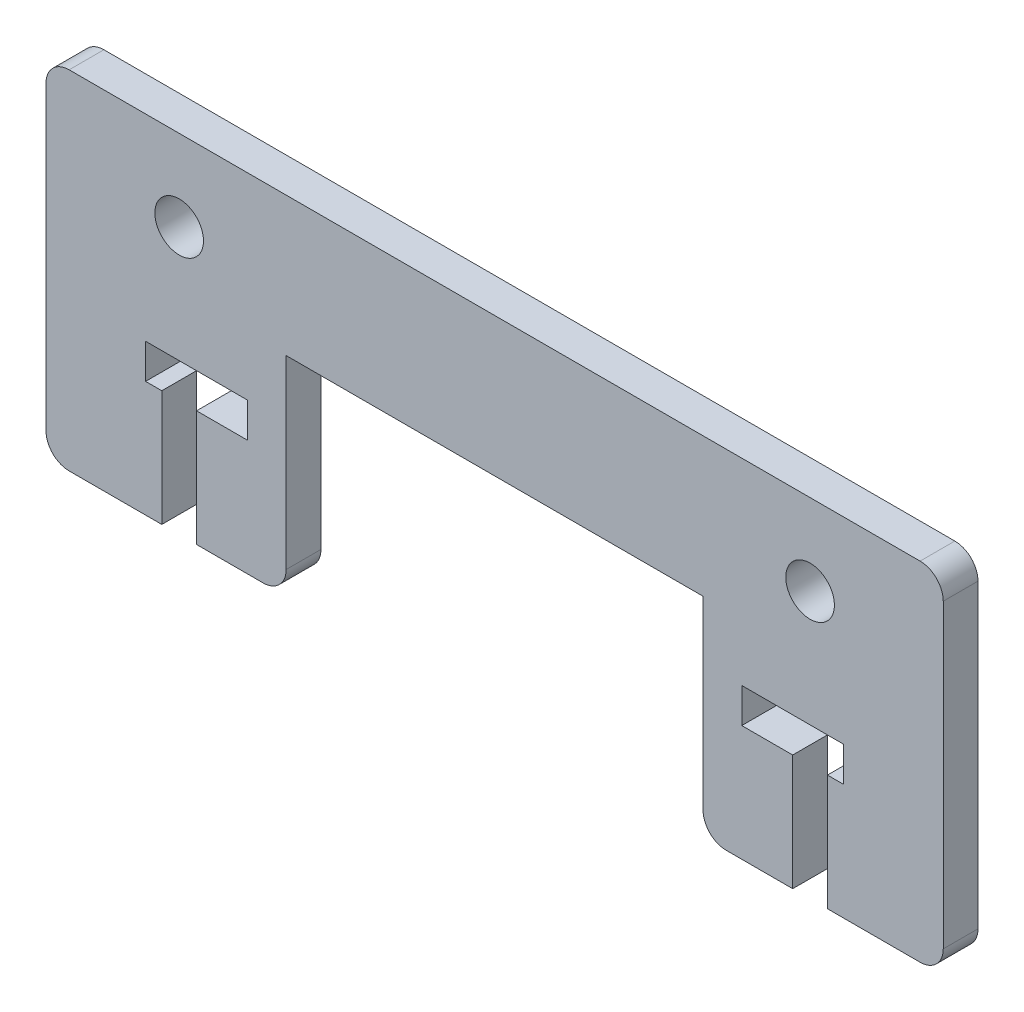
ISO-10303-21;
HEADER;
FILE_DESCRIPTION(('STEP AP214'),'2;1');
FILE_NAME('part.step','',(''),(''),'','','');
FILE_SCHEMA(('AUTOMOTIVE_DESIGN { 1 0 10303 214 1 1 1 1 }'));
ENDSEC;
DATA;
#1=APPLICATION_CONTEXT('core data for automotive mechanical design processes');
#2=APPLICATION_PROTOCOL_DEFINITION('international standard','automotive_design',2000,#1);
#3=PRODUCT_CONTEXT('',#1,'mechanical');
#4=PRODUCT('Part','Part','',(#3));
#5=PRODUCT_RELATED_PRODUCT_CATEGORY('part','',(#4));
#6=PRODUCT_DEFINITION_FORMATION('','',#4);
#7=PRODUCT_DEFINITION_CONTEXT('part definition',#1,'design');
#8=PRODUCT_DEFINITION('design','',#6,#7);
#9=PRODUCT_DEFINITION_SHAPE('','',#8);
#10=(LENGTH_UNIT() NAMED_UNIT(*) SI_UNIT(.MILLI.,.METRE.));
#11=(NAMED_UNIT(*) PLANE_ANGLE_UNIT() SI_UNIT($,.RADIAN.));
#12=(NAMED_UNIT(*) SI_UNIT($,.STERADIAN.) SOLID_ANGLE_UNIT());
#13=UNCERTAINTY_MEASURE_WITH_UNIT(LENGTH_MEASURE(1.E-05),#10,'distance_accuracy_value','');
#14=(GEOMETRIC_REPRESENTATION_CONTEXT(3) GLOBAL_UNCERTAINTY_ASSIGNED_CONTEXT((#13)) GLOBAL_UNIT_ASSIGNED_CONTEXT((#10,
#11,#12)) REPRESENTATION_CONTEXT('',''));
#15=CARTESIAN_POINT('',(0.,0.,0.));
#16=DIRECTION('',(0.,0.,1.));
#17=DIRECTION('',(1.,0.,0.));
#18=AXIS2_PLACEMENT_3D('',#15,#16,#17);
#19=CARTESIAN_POINT('',(0.,0.,1.5));
#20=DIRECTION('',(0.,0.,1.));
#21=DIRECTION('',(1.,0.,0.));
#22=AXIS2_PLACEMENT_3D('',#19,#20,#21);
#23=PLANE('',#22);
#24=CARTESIAN_POINT('',(27.94,53.4586120346529,1.5));
#25=DIRECTION('',(0.,0.,1.));
#26=DIRECTION('',(1.,0.,0.));
#27=AXIS2_PLACEMENT_3D('',#24,#25,#26);
#28=CIRCLE('',#27,1.05);
#29=CARTESIAN_POINT('',(28.99,53.4586120346529,1.5));
#30=VERTEX_POINT('',#29);
#31=EDGE_CURVE('E542',#30,#30,#28,.T.);
#32=ORIENTED_EDGE('',*,*,#31,.F.);
#33=EDGE_LOOP('',(#32));
#34=FACE_BOUND('',#33,.T.);
#35=DIRECTION('',(0.,-1.,0.));
#36=VECTOR('',#35,1.);
#37=CARTESIAN_POINT('',(23.32,41.9586120346529,1.5));
#38=LINE('',#37,#36);
#39=CARTESIAN_POINT('',(23.32,50.9586120346529,1.5));
#40=VERTEX_POINT('',#39);
#41=CARTESIAN_POINT('',(23.32,42.9586120346529,1.5));
#42=VERTEX_POINT('',#41);
#43=EDGE_CURVE('E560',#40,#42,#38,.T.);
#44=ORIENTED_EDGE('',*,*,#43,.T.);
#45=CARTESIAN_POINT('',(24.32,42.9586120346529,1.5));
#46=DIRECTION('',(0.,0.,1.));
#47=DIRECTION('',(1.,0.,0.));
#48=AXIS2_PLACEMENT_3D('',#45,#46,#47);
#49=CIRCLE('',#48,1.);
#50=CARTESIAN_POINT('',(24.32,41.9586120346529,1.5));
#51=VERTEX_POINT('',#50);
#52=EDGE_CURVE('E311',#42,#51,#49,.T.);
#53=ORIENTED_EDGE('',*,*,#52,.T.);
#54=DIRECTION('',(1.,0.,0.));
#55=VECTOR('',#54,1.);
#56=CARTESIAN_POINT('',(23.32,41.9586120346529,1.5));
#57=LINE('',#56,#55);
#58=CARTESIAN_POINT('',(27.19,41.9586120346529,1.5));
#59=VERTEX_POINT('',#58);
#60=EDGE_CURVE('E566',#51,#59,#57,.T.);
#61=ORIENTED_EDGE('',*,*,#60,.T.);
#62=DIRECTION('',(0.,1.,0.));
#63=VECTOR('',#62,1.);
#64=CARTESIAN_POINT('',(27.19,41.9586120346529,1.5));
#65=LINE('',#64,#63);
#66=CARTESIAN_POINT('',(27.19,46.9586120346529,1.5));
#67=VERTEX_POINT('',#66);
#68=EDGE_CURVE('E569',#59,#67,#65,.T.);
#69=ORIENTED_EDGE('',*,*,#68,.T.);
#70=DIRECTION('',(-1.,0.,0.));
#71=VECTOR('',#70,1.);
#72=CARTESIAN_POINT('',(27.19,46.9586120346529,1.5));
#73=LINE('',#72,#71);
#74=CARTESIAN_POINT('',(24.99,46.9586120346529,1.5));
#75=VERTEX_POINT('',#74);
#76=EDGE_CURVE('E572',#67,#75,#73,.T.);
#77=ORIENTED_EDGE('',*,*,#76,.T.);
#78=DIRECTION('',(0.,1.,0.));
#79=VECTOR('',#78,1.);
#80=CARTESIAN_POINT('',(24.99,46.9586120346529,1.5));
#81=LINE('',#80,#79);
#82=CARTESIAN_POINT('',(24.99,48.4586120346529,1.5));
#83=VERTEX_POINT('',#82);
#84=EDGE_CURVE('E575',#75,#83,#81,.T.);
#85=ORIENTED_EDGE('',*,*,#84,.T.);
#86=DIRECTION('',(1.,0.,0.));
#87=VECTOR('',#86,1.);
#88=CARTESIAN_POINT('',(24.99,48.4586120346529,1.5));
#89=LINE('',#88,#87);
#90=CARTESIAN_POINT('',(29.39,48.4586120346529,1.5));
#91=VERTEX_POINT('',#90);
#92=EDGE_CURVE('E578',#83,#91,#89,.T.);
#93=ORIENTED_EDGE('',*,*,#92,.T.);
#94=DIRECTION('',(0.,-1.,0.));
#95=VECTOR('',#94,1.);
#96=CARTESIAN_POINT('',(29.39,48.4586120346529,1.5));
#97=LINE('',#96,#95);
#98=CARTESIAN_POINT('',(29.39,46.9586120346529,1.5));
#99=VERTEX_POINT('',#98);
#100=EDGE_CURVE('E581',#91,#99,#97,.T.);
#101=ORIENTED_EDGE('',*,*,#100,.T.);
#102=DIRECTION('',(-1.,0.,0.));
#103=VECTOR('',#102,1.);
#104=CARTESIAN_POINT('',(29.39,46.9586120346529,1.5));
#105=LINE('',#104,#103);
#106=CARTESIAN_POINT('',(28.69,46.9586120346529,1.5));
#107=VERTEX_POINT('',#106);
#108=EDGE_CURVE('E584',#99,#107,#105,.T.);
#109=ORIENTED_EDGE('',*,*,#108,.T.);
#110=DIRECTION('',(0.,-1.,0.));
#111=VECTOR('',#110,1.);
#112=CARTESIAN_POINT('',(28.69,46.9586120346529,1.5));
#113=LINE('',#112,#111);
#114=CARTESIAN_POINT('',(28.69,41.9586120346529,1.5));
#115=VERTEX_POINT('',#114);
#116=EDGE_CURVE('E587',#107,#115,#113,.T.);
#117=ORIENTED_EDGE('',*,*,#116,.T.);
#118=DIRECTION('',(1.,0.,0.));
#119=VECTOR('',#118,1.);
#120=CARTESIAN_POINT('',(33.69,41.9586120346529,1.5));
#121=LINE('',#120,#119);
#122=CARTESIAN_POINT('',(32.69,41.9586120346529,1.5));
#123=VERTEX_POINT('',#122);
#124=EDGE_CURVE('E519',#115,#123,#121,.T.);
#125=ORIENTED_EDGE('',*,*,#124,.T.);
#126=CARTESIAN_POINT('',(32.69,42.9586120346529,1.5));
#127=DIRECTION('',(0.,0.,1.));
#128=DIRECTION('',(1.,0.,0.));
#129=AXIS2_PLACEMENT_3D('',#126,#127,#128);
#130=CIRCLE('',#129,1.);
#131=CARTESIAN_POINT('',(33.69,42.9586120346529,1.5));
#132=VERTEX_POINT('',#131);
#133=EDGE_CURVE('E305',#123,#132,#130,.T.);
#134=ORIENTED_EDGE('',*,*,#133,.T.);
#135=DIRECTION('',(0.,1.,0.));
#136=VECTOR('',#135,1.);
#137=CARTESIAN_POINT('',(33.69,56.9586120346529,1.5));
#138=LINE('',#137,#136);
#139=CARTESIAN_POINT('',(33.69,55.9586120346529,1.5));
#140=VERTEX_POINT('',#139);
#141=EDGE_CURVE('E509',#132,#140,#138,.T.);
#142=ORIENTED_EDGE('',*,*,#141,.T.);
#143=CARTESIAN_POINT('',(32.69,55.9586120346529,1.5));
#144=DIRECTION('',(0.,0.,1.));
#145=DIRECTION('',(1.,0.,0.));
#146=AXIS2_PLACEMENT_3D('',#143,#144,#145);
#147=CIRCLE('',#146,1.);
#148=CARTESIAN_POINT('',(32.69,56.9586120346529,1.5));
#149=VERTEX_POINT('',#148);
#150=EDGE_CURVE('E302',#140,#149,#147,.T.);
#151=ORIENTED_EDGE('',*,*,#150,.T.);
#152=DIRECTION('',(-1.,0.,0.));
#153=VECTOR('',#152,1.);
#154=CARTESIAN_POINT('',(14.32,56.9586120346529,1.5));
#155=LINE('',#154,#153);
#156=CARTESIAN_POINT('',(-4.05,56.9586120346529,1.5));
#157=VERTEX_POINT('',#156);
#158=EDGE_CURVE('E508',#149,#157,#155,.T.);
#159=ORIENTED_EDGE('',*,*,#158,.T.);
#160=CARTESIAN_POINT('',(-4.05,55.9586120346529,1.5));
#161=DIRECTION('',(0.,0.,1.));
#162=DIRECTION('',(1.,0.,0.));
#163=AXIS2_PLACEMENT_3D('',#160,#161,#162);
#164=CIRCLE('',#163,1.);
#165=CARTESIAN_POINT('',(-5.05,55.9586120346529,1.5));
#166=VERTEX_POINT('',#165);
#167=EDGE_CURVE('E297',#157,#166,#164,.T.);
#168=ORIENTED_EDGE('',*,*,#167,.T.);
#169=DIRECTION('',(0.,-1.,0.));
#170=VECTOR('',#169,1.);
#171=CARTESIAN_POINT('',(-5.05,41.9586120346529,1.5));
#172=LINE('',#171,#170);
#173=CARTESIAN_POINT('',(-5.05,42.9586120346529,1.5));
#174=VERTEX_POINT('',#173);
#175=EDGE_CURVE('E347',#166,#174,#172,.T.);
#176=ORIENTED_EDGE('',*,*,#175,.T.);
#177=CARTESIAN_POINT('',(-4.05,42.9586120346529,1.5));
#178=DIRECTION('',(0.,0.,1.));
#179=DIRECTION('',(1.,0.,0.));
#180=AXIS2_PLACEMENT_3D('',#177,#178,#179);
#181=CIRCLE('',#180,1.);
#182=CARTESIAN_POINT('',(-4.05,41.9586120346529,1.5));
#183=VERTEX_POINT('',#182);
#184=EDGE_CURVE('E55',#174,#183,#181,.T.);
#185=ORIENTED_EDGE('',*,*,#184,.T.);
#186=DIRECTION('',(1.,0.,0.));
#187=VECTOR('',#186,1.);
#188=CARTESIAN_POINT('',(-0.0499999999999987,41.9586120346529,1.5));
#189=LINE('',#188,#187);
#190=CARTESIAN_POINT('',(-0.0499999999999987,41.9586120346529,1.5));
#191=VERTEX_POINT('',#190);
#192=EDGE_CURVE('E517',#183,#191,#189,.T.);
#193=ORIENTED_EDGE('',*,*,#192,.T.);
#194=DIRECTION('',(0.,1.,0.));
#195=VECTOR('',#194,1.);
#196=CARTESIAN_POINT('',(-0.0500000000000014,46.9586120346529,1.5));
#197=LINE('',#196,#195);
#198=CARTESIAN_POINT('',(-0.0500000000000014,46.9586120346529,1.5));
#199=VERTEX_POINT('',#198);
#200=EDGE_CURVE('E525',#191,#199,#197,.T.);
#201=ORIENTED_EDGE('',*,*,#200,.T.);
#202=DIRECTION('',(-1.,0.,0.));
#203=VECTOR('',#202,1.);
#204=CARTESIAN_POINT('',(-0.749999999999999,46.9586120346529,1.5));
#205=LINE('',#204,#203);
#206=CARTESIAN_POINT('',(-0.749999999999999,46.9586120346529,1.5));
#207=VERTEX_POINT('',#206);
#208=EDGE_CURVE('E528',#199,#207,#205,.T.);
#209=ORIENTED_EDGE('',*,*,#208,.T.);
#210=DIRECTION('',(0.,1.,0.));
#211=VECTOR('',#210,1.);
#212=CARTESIAN_POINT('',(-0.749999999999999,48.4586120346529,1.5));
#213=LINE('',#212,#211);
#214=CARTESIAN_POINT('',(-0.749999999999999,48.4586120346529,1.5));
#215=VERTEX_POINT('',#214);
#216=EDGE_CURVE('E531',#207,#215,#213,.T.);
#217=ORIENTED_EDGE('',*,*,#216,.T.);
#218=DIRECTION('',(1.,0.,0.));
#219=VECTOR('',#218,1.);
#220=CARTESIAN_POINT('',(3.65,48.4586120346529,1.5));
#221=LINE('',#220,#219);
#222=CARTESIAN_POINT('',(3.65,48.4586120346529,1.5));
#223=VERTEX_POINT('',#222);
#224=EDGE_CURVE('E534',#215,#223,#221,.T.);
#225=ORIENTED_EDGE('',*,*,#224,.T.);
#226=DIRECTION('',(0.,-1.,0.));
#227=VECTOR('',#226,1.);
#228=CARTESIAN_POINT('',(3.65,46.9586120346529,1.5));
#229=LINE('',#228,#227);
#230=CARTESIAN_POINT('',(3.65,46.9586120346529,1.5));
#231=VERTEX_POINT('',#230);
#232=EDGE_CURVE('E255',#223,#231,#229,.T.);
#233=ORIENTED_EDGE('',*,*,#232,.T.);
#234=DIRECTION('',(-1.,0.,0.));
#235=VECTOR('',#234,1.);
#236=CARTESIAN_POINT('',(1.45,46.9586120346529,1.5));
#237=LINE('',#236,#235);
#238=CARTESIAN_POINT('',(1.45,46.9586120346529,1.5));
#239=VERTEX_POINT('',#238);
#240=EDGE_CURVE('E249',#231,#239,#237,.T.);
#241=ORIENTED_EDGE('',*,*,#240,.T.);
#242=DIRECTION('',(0.,-1.,0.));
#243=VECTOR('',#242,1.);
#244=CARTESIAN_POINT('',(1.45,41.9586120346529,1.5));
#245=LINE('',#244,#243);
#246=CARTESIAN_POINT('',(1.45,41.9586120346529,1.5));
#247=VERTEX_POINT('',#246);
#248=EDGE_CURVE('E237',#239,#247,#245,.T.);
#249=ORIENTED_EDGE('',*,*,#248,.T.);
#250=DIRECTION('',(1.,0.,0.));
#251=VECTOR('',#250,1.);
#252=CARTESIAN_POINT('',(1.45,41.9586120346529,1.5));
#253=LINE('',#252,#251);
#254=CARTESIAN_POINT('',(4.32,41.9586120346529,1.5));
#255=VERTEX_POINT('',#254);
#256=EDGE_CURVE('E248',#247,#255,#253,.T.);
#257=ORIENTED_EDGE('',*,*,#256,.T.);
#258=CARTESIAN_POINT('',(4.32000000000001,42.9586120346529,1.5));
#259=DIRECTION('',(0.,0.,1.));
#260=DIRECTION('',(1.,0.,0.));
#261=AXIS2_PLACEMENT_3D('',#258,#259,#260);
#262=CIRCLE('',#261,1.);
#263=CARTESIAN_POINT('',(5.32000000000001,42.9586120346529,1.5));
#264=VERTEX_POINT('',#263);
#265=EDGE_CURVE('E308',#255,#264,#262,.T.);
#266=ORIENTED_EDGE('',*,*,#265,.T.);
#267=DIRECTION('',(0.,1.,0.));
#268=VECTOR('',#267,1.);
#269=CARTESIAN_POINT('',(5.32000000000001,41.9586120346529,1.5));
#270=LINE('',#269,#268);
#271=CARTESIAN_POINT('',(5.32000000000001,50.9586120346529,1.5));
#272=VERTEX_POINT('',#271);
#273=EDGE_CURVE('E554',#264,#272,#270,.T.);
#274=ORIENTED_EDGE('',*,*,#273,.T.);
#275=DIRECTION('',(1.,0.,0.));
#276=VECTOR('',#275,1.);
#277=CARTESIAN_POINT('',(5.32000000000001,50.9586120346529,1.5));
#278=LINE('',#277,#276);
#279=EDGE_CURVE('E449',#272,#40,#278,.T.);
#280=ORIENTED_EDGE('',*,*,#279,.T.);
#281=EDGE_LOOP('',(#44,#53,#61,#69,#77,#85,#93,#101,#109,#117,#125,#134,#142,#151,#159,#168,
#176,#185,#193,#201,#209,#217,#225,#233,#241,#249,#257,#266,#274,#280));
#282=FACE_BOUND('',#281,.T.);
#283=CARTESIAN_POINT('',(0.699999999999999,53.4586120346529,1.5));
#284=DIRECTION('',(0.,0.,1.));
#285=DIRECTION('',(-1.,0.,0.));
#286=AXIS2_PLACEMENT_3D('',#283,#284,#285);
#287=CIRCLE('',#286,1.04999999999999);
#288=CARTESIAN_POINT('',(-0.34999999999999,53.4586120346529,1.5));
#289=VERTEX_POINT('',#288);
#290=EDGE_CURVE('E963',#289,#289,#287,.T.);
#291=ORIENTED_EDGE('',*,*,#290,.F.);
#292=EDGE_LOOP('',(#291));
#293=FACE_BOUND('',#292,.T.);
#294=ADVANCED_FACE('F39',(#34,#282,#293),#23,.T.);
#295=CARTESIAN_POINT('',(0.,0.,0.));
#296=DIRECTION('',(0.,0.,1.));
#297=DIRECTION('',(1.,0.,0.));
#298=AXIS2_PLACEMENT_3D('',#295,#296,#297);
#299=PLANE('',#298);
#300=DIRECTION('',(1.,0.,0.));
#301=VECTOR('',#300,1.);
#302=CARTESIAN_POINT('',(23.32,41.9586120346529,0.));
#303=LINE('',#302,#301);
#304=CARTESIAN_POINT('',(24.32,41.9586120346529,0.));
#305=VERTEX_POINT('',#304);
#306=CARTESIAN_POINT('',(27.19,41.9586120346529,0.));
#307=VERTEX_POINT('',#306);
#308=EDGE_CURVE('E461',#305,#307,#303,.T.);
#309=ORIENTED_EDGE('',*,*,#308,.F.);
#310=CARTESIAN_POINT('',(24.32,42.9586120346529,0.));
#311=DIRECTION('',(0.,0.,1.));
#312=DIRECTION('',(1.,0.,0.));
#313=AXIS2_PLACEMENT_3D('',#310,#311,#312);
#314=CIRCLE('',#313,1.);
#315=CARTESIAN_POINT('',(23.32,42.9586120346529,0.));
#316=VERTEX_POINT('',#315);
#317=EDGE_CURVE('E291',#305,#316,#314,.F.);
#318=ORIENTED_EDGE('',*,*,#317,.T.);
#319=DIRECTION('',(0.,-1.,0.));
#320=VECTOR('',#319,1.);
#321=CARTESIAN_POINT('',(23.32,41.9586120346529,0.));
#322=LINE('',#321,#320);
#323=CARTESIAN_POINT('',(23.32,50.9586120346529,0.));
#324=VERTEX_POINT('',#323);
#325=EDGE_CURVE('E456',#324,#316,#322,.T.);
#326=ORIENTED_EDGE('',*,*,#325,.F.);
#327=DIRECTION('',(1.,0.,0.));
#328=VECTOR('',#327,1.);
#329=CARTESIAN_POINT('',(5.32000000000001,50.9586120346529,0.));
#330=LINE('',#329,#328);
#331=CARTESIAN_POINT('',(5.32000000000001,50.9586120346529,0.));
#332=VERTEX_POINT('',#331);
#333=EDGE_CURVE('E448',#332,#324,#330,.T.);
#334=ORIENTED_EDGE('',*,*,#333,.F.);
#335=DIRECTION('',(0.,1.,0.));
#336=VECTOR('',#335,1.);
#337=CARTESIAN_POINT('',(5.32000000000001,41.9586120346529,0.));
#338=LINE('',#337,#336);
#339=CARTESIAN_POINT('',(5.32000000000001,42.9586120346529,0.));
#340=VERTEX_POINT('',#339);
#341=EDGE_CURVE('E454',#340,#332,#338,.T.);
#342=ORIENTED_EDGE('',*,*,#341,.F.);
#343=CARTESIAN_POINT('',(4.32000000000001,42.9586120346529,0.));
#344=DIRECTION('',(0.,0.,1.));
#345=DIRECTION('',(1.,0.,0.));
#346=AXIS2_PLACEMENT_3D('',#343,#344,#345);
#347=CIRCLE('',#346,1.);
#348=CARTESIAN_POINT('',(4.32,41.9586120346529,0.));
#349=VERTEX_POINT('',#348);
#350=EDGE_CURVE('E288',#340,#349,#347,.F.);
#351=ORIENTED_EDGE('',*,*,#350,.T.);
#352=DIRECTION('',(1.,0.,0.));
#353=VECTOR('',#352,1.);
#354=CARTESIAN_POINT('',(1.45,41.9586120346529,0.));
#355=LINE('',#354,#353);
#356=CARTESIAN_POINT('',(1.45,41.9586120346529,0.));
#357=VERTEX_POINT('',#356);
#358=EDGE_CURVE('E463',#357,#349,#355,.T.);
#359=ORIENTED_EDGE('',*,*,#358,.F.);
#360=DIRECTION('',(0.,-1.,0.));
#361=VECTOR('',#360,1.);
#362=CARTESIAN_POINT('',(1.45,41.9586120346529,0.));
#363=LINE('',#362,#361);
#364=CARTESIAN_POINT('',(1.45,46.9586120346529,0.));
#365=VERTEX_POINT('',#364);
#366=EDGE_CURVE('E541',#365,#357,#363,.T.);
#367=ORIENTED_EDGE('',*,*,#366,.F.);
#368=DIRECTION('',(-1.,0.,0.));
#369=VECTOR('',#368,1.);
#370=CARTESIAN_POINT('',(1.45,46.9586120346529,0.));
#371=LINE('',#370,#369);
#372=CARTESIAN_POINT('',(3.65,46.9586120346529,0.));
#373=VERTEX_POINT('',#372);
#374=EDGE_CURVE('E264',#373,#365,#371,.T.);
#375=ORIENTED_EDGE('',*,*,#374,.F.);
#376=DIRECTION('',(0.,-1.,0.));
#377=VECTOR('',#376,1.);
#378=CARTESIAN_POINT('',(3.65,46.9586120346529,0.));
#379=LINE('',#378,#377);
#380=CARTESIAN_POINT('',(3.65,48.4586120346529,0.));
#381=VERTEX_POINT('',#380);
#382=EDGE_CURVE('E260',#381,#373,#379,.T.);
#383=ORIENTED_EDGE('',*,*,#382,.F.);
#384=DIRECTION('',(1.,0.,0.));
#385=VECTOR('',#384,1.);
#386=CARTESIAN_POINT('',(3.65,48.4586120346529,0.));
#387=LINE('',#386,#385);
#388=CARTESIAN_POINT('',(-0.749999999999999,48.4586120346529,0.));
#389=VERTEX_POINT('',#388);
#390=EDGE_CURVE('E377',#389,#381,#387,.T.);
#391=ORIENTED_EDGE('',*,*,#390,.F.);
#392=DIRECTION('',(0.,1.,0.));
#393=VECTOR('',#392,1.);
#394=CARTESIAN_POINT('',(-0.749999999999999,48.4586120346529,0.));
#395=LINE('',#394,#393);
#396=CARTESIAN_POINT('',(-0.749999999999999,46.9586120346529,0.));
#397=VERTEX_POINT('',#396);
#398=EDGE_CURVE('E374',#397,#389,#395,.T.);
#399=ORIENTED_EDGE('',*,*,#398,.F.);
#400=DIRECTION('',(-1.,0.,0.));
#401=VECTOR('',#400,1.);
#402=CARTESIAN_POINT('',(-0.749999999999999,46.9586120346529,0.));
#403=LINE('',#402,#401);
#404=CARTESIAN_POINT('',(-0.0500000000000014,46.9586120346529,0.));
#405=VERTEX_POINT('',#404);
#406=EDGE_CURVE('E371',#405,#397,#403,.T.);
#407=ORIENTED_EDGE('',*,*,#406,.F.);
#408=DIRECTION('',(0.,1.,0.));
#409=VECTOR('',#408,1.);
#410=CARTESIAN_POINT('',(-0.0500000000000014,46.9586120346529,0.));
#411=LINE('',#410,#409);
#412=CARTESIAN_POINT('',(-0.0499999999999987,41.9586120346529,0.));
#413=VERTEX_POINT('',#412);
#414=EDGE_CURVE('E363',#413,#405,#411,.T.);
#415=ORIENTED_EDGE('',*,*,#414,.F.);
#416=DIRECTION('',(1.,0.,0.));
#417=VECTOR('',#416,1.);
#418=CARTESIAN_POINT('',(-0.0499999999999987,41.9586120346529,0.));
#419=LINE('',#418,#417);
#420=CARTESIAN_POINT('',(-4.05,41.9586120346529,0.));
#421=VERTEX_POINT('',#420);
#422=EDGE_CURVE('E358',#421,#413,#419,.T.);
#423=ORIENTED_EDGE('',*,*,#422,.F.);
#424=CARTESIAN_POINT('',(-4.05,42.9586120346529,0.));
#425=DIRECTION('',(0.,0.,1.));
#426=DIRECTION('',(1.,0.,0.));
#427=AXIS2_PLACEMENT_3D('',#424,#425,#426);
#428=CIRCLE('',#427,1.);
#429=CARTESIAN_POINT('',(-5.05,42.9586120346529,0.));
#430=VERTEX_POINT('',#429);
#431=EDGE_CURVE('E279',#421,#430,#428,.F.);
#432=ORIENTED_EDGE('',*,*,#431,.T.);
#433=DIRECTION('',(0.,-1.,0.));
#434=VECTOR('',#433,1.);
#435=CARTESIAN_POINT('',(-5.05,41.9586120346529,0.));
#436=LINE('',#435,#434);
#437=CARTESIAN_POINT('',(-5.05,55.9586120346529,0.));
#438=VERTEX_POINT('',#437);
#439=EDGE_CURVE('E346',#438,#430,#436,.T.);
#440=ORIENTED_EDGE('',*,*,#439,.F.);
#441=CARTESIAN_POINT('',(-4.05,55.9586120346529,0.));
#442=DIRECTION('',(0.,0.,1.));
#443=DIRECTION('',(1.,0.,0.));
#444=AXIS2_PLACEMENT_3D('',#441,#442,#443);
#445=CIRCLE('',#444,1.);
#446=CARTESIAN_POINT('',(-4.05,56.9586120346529,0.));
#447=VERTEX_POINT('',#446);
#448=EDGE_CURVE('E271',#438,#447,#445,.F.);
#449=ORIENTED_EDGE('',*,*,#448,.T.);
#450=DIRECTION('',(-1.,0.,0.));
#451=VECTOR('',#450,1.);
#452=CARTESIAN_POINT('',(-5.05,56.9586120346529,0.));
#453=LINE('',#452,#451);
#454=CARTESIAN_POINT('',(32.69,56.9586120346529,0.));
#455=VERTEX_POINT('',#454);
#456=EDGE_CURVE('E359',#455,#447,#453,.T.);
#457=ORIENTED_EDGE('',*,*,#456,.F.);
#458=CARTESIAN_POINT('',(32.69,55.9586120346529,0.));
#459=DIRECTION('',(0.,0.,1.));
#460=DIRECTION('',(1.,0.,0.));
#461=AXIS2_PLACEMENT_3D('',#458,#459,#460);
#462=CIRCLE('',#461,1.);
#463=CARTESIAN_POINT('',(33.69,55.9586120346529,0.));
#464=VERTEX_POINT('',#463);
#465=EDGE_CURVE('E282',#455,#464,#462,.F.);
#466=ORIENTED_EDGE('',*,*,#465,.T.);
#467=DIRECTION('',(0.,1.,0.));
#468=VECTOR('',#467,1.);
#469=CARTESIAN_POINT('',(33.69,56.9586120346529,0.));
#470=LINE('',#469,#468);
#471=CARTESIAN_POINT('',(33.69,42.9586120346529,0.));
#472=VERTEX_POINT('',#471);
#473=EDGE_CURVE('E365',#472,#464,#470,.T.);
#474=ORIENTED_EDGE('',*,*,#473,.F.);
#475=CARTESIAN_POINT('',(32.69,42.9586120346529,0.));
#476=DIRECTION('',(0.,0.,1.));
#477=DIRECTION('',(1.,0.,0.));
#478=AXIS2_PLACEMENT_3D('',#475,#476,#477);
#479=CIRCLE('',#478,1.);
#480=CARTESIAN_POINT('',(32.69,41.9586120346529,0.));
#481=VERTEX_POINT('',#480);
#482=EDGE_CURVE('E285',#472,#481,#479,.F.);
#483=ORIENTED_EDGE('',*,*,#482,.T.);
#484=DIRECTION('',(1.,0.,0.));
#485=VECTOR('',#484,1.);
#486=CARTESIAN_POINT('',(33.69,41.9586120346529,0.));
#487=LINE('',#486,#485);
#488=CARTESIAN_POINT('',(28.69,41.9586120346529,0.));
#489=VERTEX_POINT('',#488);
#490=EDGE_CURVE('E490',#489,#481,#487,.T.);
#491=ORIENTED_EDGE('',*,*,#490,.F.);
#492=DIRECTION('',(0.,-1.,0.));
#493=VECTOR('',#492,1.);
#494=CARTESIAN_POINT('',(28.69,46.9586120346529,0.));
#495=LINE('',#494,#493);
#496=CARTESIAN_POINT('',(28.69,46.9586120346529,0.));
#497=VERTEX_POINT('',#496);
#498=EDGE_CURVE('E487',#497,#489,#495,.T.);
#499=ORIENTED_EDGE('',*,*,#498,.F.);
#500=DIRECTION('',(-1.,0.,0.));
#501=VECTOR('',#500,1.);
#502=CARTESIAN_POINT('',(29.39,46.9586120346529,0.));
#503=LINE('',#502,#501);
#504=CARTESIAN_POINT('',(29.39,46.9586120346529,0.));
#505=VERTEX_POINT('',#504);
#506=EDGE_CURVE('E484',#505,#497,#503,.T.);
#507=ORIENTED_EDGE('',*,*,#506,.F.);
#508=DIRECTION('',(0.,-1.,0.));
#509=VECTOR('',#508,1.);
#510=CARTESIAN_POINT('',(29.39,48.4586120346529,0.));
#511=LINE('',#510,#509);
#512=CARTESIAN_POINT('',(29.39,48.4586120346529,0.));
#513=VERTEX_POINT('',#512);
#514=EDGE_CURVE('E481',#513,#505,#511,.T.);
#515=ORIENTED_EDGE('',*,*,#514,.F.);
#516=DIRECTION('',(1.,0.,0.));
#517=VECTOR('',#516,1.);
#518=CARTESIAN_POINT('',(24.99,48.4586120346529,0.));
#519=LINE('',#518,#517);
#520=CARTESIAN_POINT('',(24.99,48.4586120346529,0.));
#521=VERTEX_POINT('',#520);
#522=EDGE_CURVE('E478',#521,#513,#519,.T.);
#523=ORIENTED_EDGE('',*,*,#522,.F.);
#524=DIRECTION('',(0.,1.,0.));
#525=VECTOR('',#524,1.);
#526=CARTESIAN_POINT('',(24.99,46.9586120346529,0.));
#527=LINE('',#526,#525);
#528=CARTESIAN_POINT('',(24.99,46.9586120346529,0.));
#529=VERTEX_POINT('',#528);
#530=EDGE_CURVE('E475',#529,#521,#527,.T.);
#531=ORIENTED_EDGE('',*,*,#530,.F.);
#532=DIRECTION('',(-1.,0.,0.));
#533=VECTOR('',#532,1.);
#534=CARTESIAN_POINT('',(27.19,46.9586120346529,0.));
#535=LINE('',#534,#533);
#536=CARTESIAN_POINT('',(27.19,46.9586120346529,0.));
#537=VERTEX_POINT('',#536);
#538=EDGE_CURVE('E472',#537,#529,#535,.T.);
#539=ORIENTED_EDGE('',*,*,#538,.F.);
#540=DIRECTION('',(0.,1.,0.));
#541=VECTOR('',#540,1.);
#542=CARTESIAN_POINT('',(27.19,41.9586120346529,0.));
#543=LINE('',#542,#541);
#544=EDGE_CURVE('E469',#307,#537,#543,.T.);
#545=ORIENTED_EDGE('',*,*,#544,.F.);
#546=EDGE_LOOP('',(#309,#318,#326,#334,#342,#351,#359,#367,#375,#383,#391,#399,#407,#415,#423,
#432,#440,#449,#457,#466,#474,#483,#491,#499,#507,#515,#523,#531,#539,#545));
#547=FACE_BOUND('',#546,.T.);
#548=CARTESIAN_POINT('',(27.94,53.4586120346529,0.));
#549=DIRECTION('',(0.,0.,1.));
#550=DIRECTION('',(1.,0.,0.));
#551=AXIS2_PLACEMENT_3D('',#548,#549,#550);
#552=CIRCLE('',#551,1.05);
#553=CARTESIAN_POINT('',(28.99,53.4586120346529,0.));
#554=VERTEX_POINT('',#553);
#555=EDGE_CURVE('E971',#554,#554,#552,.T.);
#556=ORIENTED_EDGE('',*,*,#555,.T.);
#557=EDGE_LOOP('',(#556));
#558=FACE_BOUND('',#557,.T.);
#559=CARTESIAN_POINT('',(0.699999999999999,53.4586120346529,0.));
#560=DIRECTION('',(0.,0.,1.));
#561=DIRECTION('',(-1.,0.,0.));
#562=AXIS2_PLACEMENT_3D('',#559,#560,#561);
#563=CIRCLE('',#562,1.04999999999999);
#564=CARTESIAN_POINT('',(-0.34999999999999,53.4586120346529,0.));
#565=VERTEX_POINT('',#564);
#566=EDGE_CURVE('E966',#565,#565,#563,.T.);
#567=ORIENTED_EDGE('',*,*,#566,.T.);
#568=EDGE_LOOP('',(#567));
#569=FACE_BOUND('',#568,.T.);
#570=ADVANCED_FACE('F352',(#547,#558,#569),#299,.F.);
#571=CARTESIAN_POINT('',(1.45,46.9586120346529,1.5));
#572=DIRECTION('',(0.,-1.,0.));
#573=DIRECTION('',(0.,0.,-1.));
#574=AXIS2_PLACEMENT_3D('',#571,#572,#573);
#575=PLANE('',#574);
#576=ORIENTED_EDGE('',*,*,#374,.T.);
#577=DIRECTION('',(0.,0.,-1.));
#578=VECTOR('',#577,1.);
#579=CARTESIAN_POINT('',(1.45,46.9586120346529,1.5));
#580=LINE('',#579,#578);
#581=EDGE_CURVE('E241',#239,#365,#580,.T.);
#582=ORIENTED_EDGE('',*,*,#581,.F.);
#583=ORIENTED_EDGE('',*,*,#240,.F.);
#584=DIRECTION('',(0.,0.,-1.));
#585=VECTOR('',#584,1.);
#586=CARTESIAN_POINT('',(3.65,46.9586120346529,1.5));
#587=LINE('',#586,#585);
#588=EDGE_CURVE('E382',#231,#373,#587,.T.);
#589=ORIENTED_EDGE('',*,*,#588,.T.);
#590=EDGE_LOOP('',(#576,#582,#583,#589));
#591=FACE_BOUND('',#590,.T.);
#592=ADVANCED_FACE('F262',(#591),#575,.F.);
#593=CARTESIAN_POINT('',(1.45,41.9586120346529,1.5));
#594=DIRECTION('',(1.,0.,0.));
#595=DIRECTION('',(0.,1.,0.));
#596=AXIS2_PLACEMENT_3D('',#593,#594,#595);
#597=PLANE('',#596);
#598=ORIENTED_EDGE('',*,*,#366,.T.);
#599=DIRECTION('',(0.,0.,-1.));
#600=VECTOR('',#599,1.);
#601=CARTESIAN_POINT('',(1.45,41.9586120346529,1.5));
#602=LINE('',#601,#600);
#603=EDGE_CURVE('E244',#247,#357,#602,.T.);
#604=ORIENTED_EDGE('',*,*,#603,.F.);
#605=ORIENTED_EDGE('',*,*,#248,.F.);
#606=ORIENTED_EDGE('',*,*,#581,.T.);
#607=EDGE_LOOP('',(#598,#604,#605,#606));
#608=FACE_BOUND('',#607,.T.);
#609=ADVANCED_FACE('F239',(#608),#597,.F.);
#610=CARTESIAN_POINT('',(1.45,41.9586120346529,1.5));
#611=DIRECTION('',(0.,1.,0.));
#612=DIRECTION('',(0.,0.,1.));
#613=AXIS2_PLACEMENT_3D('',#610,#611,#612);
#614=PLANE('',#613);
#615=ORIENTED_EDGE('',*,*,#358,.T.);
#616=DIRECTION('',(0.,0.,-1.));
#617=VECTOR('',#616,1.);
#618=CARTESIAN_POINT('',(4.32000000000001,41.9586120346529,1.5));
#619=LINE('',#618,#617);
#620=EDGE_CURVE('E318',#349,#255,#619,.F.);
#621=ORIENTED_EDGE('',*,*,#620,.T.);
#622=ORIENTED_EDGE('',*,*,#256,.F.);
#623=ORIENTED_EDGE('',*,*,#603,.T.);
#624=EDGE_LOOP('',(#615,#621,#622,#623));
#625=FACE_BOUND('',#624,.T.);
#626=ADVANCED_FACE('F549',(#625),#614,.F.);
#627=CARTESIAN_POINT('',(5.32000000000001,41.9586120346529,1.5));
#628=DIRECTION('',(-1.,0.,0.));
#629=DIRECTION('',(0.,0.,1.));
#630=AXIS2_PLACEMENT_3D('',#627,#628,#629);
#631=PLANE('',#630);
#632=ORIENTED_EDGE('',*,*,#273,.F.);
#633=DIRECTION('',(0.,0.,-1.));
#634=VECTOR('',#633,1.);
#635=CARTESIAN_POINT('',(5.32000000000001,42.9586120346529,1.5));
#636=LINE('',#635,#634);
#637=EDGE_CURVE('E314',#264,#340,#636,.T.);
#638=ORIENTED_EDGE('',*,*,#637,.T.);
#639=ORIENTED_EDGE('',*,*,#341,.T.);
#640=DIRECTION('',(0.,0.,-1.));
#641=VECTOR('',#640,1.);
#642=CARTESIAN_POINT('',(5.32000000000001,50.9586120346529,1.5));
#643=LINE('',#642,#641);
#644=EDGE_CURVE('E273',#272,#332,#643,.T.);
#645=ORIENTED_EDGE('',*,*,#644,.F.);
#646=EDGE_LOOP('',(#632,#638,#639,#645));
#647=FACE_BOUND('',#646,.T.);
#648=ADVANCED_FACE('F555',(#647),#631,.F.);
#649=CARTESIAN_POINT('',(5.32000000000001,50.9586120346529,1.5));
#650=DIRECTION('',(0.,1.,0.));
#651=DIRECTION('',(0.,0.,1.));
#652=AXIS2_PLACEMENT_3D('',#649,#650,#651);
#653=PLANE('',#652);
#654=ORIENTED_EDGE('',*,*,#333,.T.);
#655=DIRECTION('',(0.,0.,-1.));
#656=VECTOR('',#655,1.);
#657=CARTESIAN_POINT('',(23.32,50.9586120346529,1.5));
#658=LINE('',#657,#656);
#659=EDGE_CURVE('E437',#40,#324,#658,.T.);
#660=ORIENTED_EDGE('',*,*,#659,.F.);
#661=ORIENTED_EDGE('',*,*,#279,.F.);
#662=ORIENTED_EDGE('',*,*,#644,.T.);
#663=EDGE_LOOP('',(#654,#660,#661,#662));
#664=FACE_BOUND('',#663,.T.);
#665=ADVANCED_FACE('F446',(#664),#653,.F.);
#666=CARTESIAN_POINT('',(23.32,41.9586120346529,1.5));
#667=DIRECTION('',(1.,0.,0.));
#668=DIRECTION('',(0.,0.,-1.));
#669=AXIS2_PLACEMENT_3D('',#666,#667,#668);
#670=PLANE('',#669);
#671=ORIENTED_EDGE('',*,*,#325,.T.);
#672=DIRECTION('',(0.,0.,-1.));
#673=VECTOR('',#672,1.);
#674=CARTESIAN_POINT('',(23.32,42.9586120346529,1.5));
#675=LINE('',#674,#673);
#676=EDGE_CURVE('E294',#316,#42,#675,.F.);
#677=ORIENTED_EDGE('',*,*,#676,.T.);
#678=ORIENTED_EDGE('',*,*,#43,.F.);
#679=ORIENTED_EDGE('',*,*,#659,.T.);
#680=EDGE_LOOP('',(#671,#677,#678,#679));
#681=FACE_BOUND('',#680,.T.);
#682=ADVANCED_FACE('F645',(#681),#670,.F.);
#683=CARTESIAN_POINT('',(23.32,41.9586120346529,1.5));
#684=DIRECTION('',(0.,1.,0.));
#685=DIRECTION('',(-1.,0.,0.));
#686=AXIS2_PLACEMENT_3D('',#683,#684,#685);
#687=PLANE('',#686);
#688=ORIENTED_EDGE('',*,*,#60,.F.);
#689=DIRECTION('',(0.,0.,-1.));
#690=VECTOR('',#689,1.);
#691=CARTESIAN_POINT('',(24.32,41.9586120346529,1.5));
#692=LINE('',#691,#690);
#693=EDGE_CURVE('E266',#51,#305,#692,.T.);
#694=ORIENTED_EDGE('',*,*,#693,.T.);
#695=ORIENTED_EDGE('',*,*,#308,.T.);
#696=DIRECTION('',(0.,0.,-1.));
#697=VECTOR('',#696,1.);
#698=CARTESIAN_POINT('',(27.19,41.9586120346529,1.5));
#699=LINE('',#698,#697);
#700=EDGE_CURVE('E433',#59,#307,#699,.T.);
#701=ORIENTED_EDGE('',*,*,#700,.F.);
#702=EDGE_LOOP('',(#688,#694,#695,#701));
#703=FACE_BOUND('',#702,.T.);
#704=ADVANCED_FACE('F637',(#703),#687,.F.);
#705=CARTESIAN_POINT('',(27.19,41.9586120346529,1.5));
#706=DIRECTION('',(-1.,0.,0.));
#707=DIRECTION('',(0.,-1.,0.));
#708=AXIS2_PLACEMENT_3D('',#705,#706,#707);
#709=PLANE('',#708);
#710=ORIENTED_EDGE('',*,*,#544,.T.);
#711=DIRECTION('',(0.,0.,-1.));
#712=VECTOR('',#711,1.);
#713=CARTESIAN_POINT('',(27.19,46.9586120346529,1.5));
#714=LINE('',#713,#712);
#715=EDGE_CURVE('E429',#67,#537,#714,.T.);
#716=ORIENTED_EDGE('',*,*,#715,.F.);
#717=ORIENTED_EDGE('',*,*,#68,.F.);
#718=ORIENTED_EDGE('',*,*,#700,.T.);
#719=EDGE_LOOP('',(#710,#716,#717,#718));
#720=FACE_BOUND('',#719,.T.);
#721=ADVANCED_FACE('F633',(#720),#709,.F.);
#722=CARTESIAN_POINT('',(27.19,46.9586120346529,1.5));
#723=DIRECTION('',(0.,-1.,0.));
#724=DIRECTION('',(0.,0.,-1.));
#725=AXIS2_PLACEMENT_3D('',#722,#723,#724);
#726=PLANE('',#725);
#727=ORIENTED_EDGE('',*,*,#538,.T.);
#728=DIRECTION('',(0.,0.,-1.));
#729=VECTOR('',#728,1.);
#730=CARTESIAN_POINT('',(24.99,46.9586120346529,1.5));
#731=LINE('',#730,#729);
#732=EDGE_CURVE('E425',#75,#529,#731,.T.);
#733=ORIENTED_EDGE('',*,*,#732,.F.);
#734=ORIENTED_EDGE('',*,*,#76,.F.);
#735=ORIENTED_EDGE('',*,*,#715,.T.);
#736=EDGE_LOOP('',(#727,#733,#734,#735));
#737=FACE_BOUND('',#736,.T.);
#738=ADVANCED_FACE('F629',(#737),#726,.F.);
#739=CARTESIAN_POINT('',(24.99,46.9586120346529,1.5));
#740=DIRECTION('',(-1.,0.,0.));
#741=DIRECTION('',(0.,0.,1.));
#742=AXIS2_PLACEMENT_3D('',#739,#740,#741);
#743=PLANE('',#742);
#744=ORIENTED_EDGE('',*,*,#530,.T.);
#745=DIRECTION('',(0.,0.,-1.));
#746=VECTOR('',#745,1.);
#747=CARTESIAN_POINT('',(24.99,48.4586120346529,1.5));
#748=LINE('',#747,#746);
#749=EDGE_CURVE('E421',#83,#521,#748,.T.);
#750=ORIENTED_EDGE('',*,*,#749,.F.);
#751=ORIENTED_EDGE('',*,*,#84,.F.);
#752=ORIENTED_EDGE('',*,*,#732,.T.);
#753=EDGE_LOOP('',(#744,#750,#751,#752));
#754=FACE_BOUND('',#753,.T.);
#755=ADVANCED_FACE('F624',(#754),#743,.F.);
#756=CARTESIAN_POINT('',(24.99,48.4586120346529,1.5));
#757=DIRECTION('',(0.,1.,0.));
#758=DIRECTION('',(0.,0.,1.));
#759=AXIS2_PLACEMENT_3D('',#756,#757,#758);
#760=PLANE('',#759);
#761=ORIENTED_EDGE('',*,*,#522,.T.);
#762=DIRECTION('',(0.,0.,-1.));
#763=VECTOR('',#762,1.);
#764=CARTESIAN_POINT('',(29.39,48.4586120346529,1.5));
#765=LINE('',#764,#763);
#766=EDGE_CURVE('E417',#91,#513,#765,.T.);
#767=ORIENTED_EDGE('',*,*,#766,.F.);
#768=ORIENTED_EDGE('',*,*,#92,.F.);
#769=ORIENTED_EDGE('',*,*,#749,.T.);
#770=EDGE_LOOP('',(#761,#767,#768,#769));
#771=FACE_BOUND('',#770,.T.);
#772=ADVANCED_FACE('F618',(#771),#760,.F.);
#773=CARTESIAN_POINT('',(29.39,48.4586120346529,1.5));
#774=DIRECTION('',(1.,0.,0.));
#775=DIRECTION('',(0.,0.,-1.));
#776=AXIS2_PLACEMENT_3D('',#773,#774,#775);
#777=PLANE('',#776);
#778=ORIENTED_EDGE('',*,*,#514,.T.);
#779=DIRECTION('',(0.,0.,-1.));
#780=VECTOR('',#779,1.);
#781=CARTESIAN_POINT('',(29.39,46.9586120346529,1.5));
#782=LINE('',#781,#780);
#783=EDGE_CURVE('E413',#99,#505,#782,.T.);
#784=ORIENTED_EDGE('',*,*,#783,.F.);
#785=ORIENTED_EDGE('',*,*,#100,.F.);
#786=ORIENTED_EDGE('',*,*,#766,.T.);
#787=EDGE_LOOP('',(#778,#784,#785,#786));
#788=FACE_BOUND('',#787,.T.);
#789=ADVANCED_FACE('F614',(#788),#777,.F.);
#790=CARTESIAN_POINT('',(29.39,46.9586120346529,1.5));
#791=DIRECTION('',(0.,-1.,0.));
#792=DIRECTION('',(1.,0.,0.));
#793=AXIS2_PLACEMENT_3D('',#790,#791,#792);
#794=PLANE('',#793);
#795=ORIENTED_EDGE('',*,*,#506,.T.);
#796=DIRECTION('',(0.,0.,-1.));
#797=VECTOR('',#796,1.);
#798=CARTESIAN_POINT('',(28.69,46.9586120346529,1.5));
#799=LINE('',#798,#797);
#800=EDGE_CURVE('E409',#107,#497,#799,.T.);
#801=ORIENTED_EDGE('',*,*,#800,.F.);
#802=ORIENTED_EDGE('',*,*,#108,.F.);
#803=ORIENTED_EDGE('',*,*,#783,.T.);
#804=EDGE_LOOP('',(#795,#801,#802,#803));
#805=FACE_BOUND('',#804,.T.);
#806=ADVANCED_FACE('F609',(#805),#794,.F.);
#807=CARTESIAN_POINT('',(28.69,46.9586120346529,1.5));
#808=DIRECTION('',(1.,0.,0.));
#809=DIRECTION('',(0.,1.,0.));
#810=AXIS2_PLACEMENT_3D('',#807,#808,#809);
#811=PLANE('',#810);
#812=ORIENTED_EDGE('',*,*,#498,.T.);
#813=DIRECTION('',(0.,0.,-1.));
#814=VECTOR('',#813,1.);
#815=CARTESIAN_POINT('',(28.69,41.9586120346529,1.5));
#816=LINE('',#815,#814);
#817=EDGE_CURVE('E405',#115,#489,#816,.T.);
#818=ORIENTED_EDGE('',*,*,#817,.F.);
#819=ORIENTED_EDGE('',*,*,#116,.F.);
#820=ORIENTED_EDGE('',*,*,#800,.T.);
#821=EDGE_LOOP('',(#812,#818,#819,#820));
#822=FACE_BOUND('',#821,.T.);
#823=ADVANCED_FACE('F603',(#822),#811,.F.);
#824=CARTESIAN_POINT('',(33.69,41.9586120346529,1.5));
#825=DIRECTION('',(0.,1.,0.));
#826=DIRECTION('',(0.,0.,1.));
#827=AXIS2_PLACEMENT_3D('',#824,#825,#826);
#828=PLANE('',#827);
#829=ORIENTED_EDGE('',*,*,#490,.T.);
#830=DIRECTION('',(0.,0.,-1.));
#831=VECTOR('',#830,1.);
#832=CARTESIAN_POINT('',(32.69,41.9586120346529,1.5));
#833=LINE('',#832,#831);
#834=EDGE_CURVE('E328',#481,#123,#833,.F.);
#835=ORIENTED_EDGE('',*,*,#834,.T.);
#836=ORIENTED_EDGE('',*,*,#124,.F.);
#837=ORIENTED_EDGE('',*,*,#817,.T.);
#838=EDGE_LOOP('',(#829,#835,#836,#837));
#839=FACE_BOUND('',#838,.T.);
#840=ADVANCED_FACE('F601',(#839),#828,.F.);
#841=CARTESIAN_POINT('',(33.69,56.9586120346529,1.5));
#842=DIRECTION('',(-1.,0.,0.));
#843=DIRECTION('',(0.,-1.,0.));
#844=AXIS2_PLACEMENT_3D('',#841,#842,#843);
#845=PLANE('',#844);
#846=ORIENTED_EDGE('',*,*,#141,.F.);
#847=DIRECTION('',(0.,0.,-1.));
#848=VECTOR('',#847,1.);
#849=CARTESIAN_POINT('',(33.69,42.9586120346529,1.5));
#850=LINE('',#849,#848);
#851=EDGE_CURVE('E324',#132,#472,#850,.T.);
#852=ORIENTED_EDGE('',*,*,#851,.T.);
#853=ORIENTED_EDGE('',*,*,#473,.T.);
#854=DIRECTION('',(0.,0.,-1.));
#855=VECTOR('',#854,1.);
#856=CARTESIAN_POINT('',(33.69,55.9586120346529,1.5));
#857=LINE('',#856,#855);
#858=EDGE_CURVE('E321',#464,#140,#857,.F.);
#859=ORIENTED_EDGE('',*,*,#858,.T.);
#860=EDGE_LOOP('',(#846,#852,#853,#859));
#861=FACE_BOUND('',#860,.T.);
#862=ADVANCED_FACE('F499',(#861),#845,.F.);
#863=CARTESIAN_POINT('',(-5.05,56.9586120346529,1.5));
#864=DIRECTION('',(0.,-1.,0.));
#865=DIRECTION('',(1.,0.,0.));
#866=AXIS2_PLACEMENT_3D('',#863,#864,#865);
#867=PLANE('',#866);
#868=ORIENTED_EDGE('',*,*,#158,.F.);
#869=DIRECTION('',(0.,0.,-1.));
#870=VECTOR('',#869,1.);
#871=CARTESIAN_POINT('',(32.69,56.9586120346529,1.5));
#872=LINE('',#871,#870);
#873=EDGE_CURVE('E334',#149,#455,#872,.T.);
#874=ORIENTED_EDGE('',*,*,#873,.T.);
#875=ORIENTED_EDGE('',*,*,#456,.T.);
#876=DIRECTION('',(0.,0.,-1.));
#877=VECTOR('',#876,1.);
#878=CARTESIAN_POINT('',(-4.05,56.9586120346529,1.5));
#879=LINE('',#878,#877);
#880=EDGE_CURVE('E331',#447,#157,#879,.F.);
#881=ORIENTED_EDGE('',*,*,#880,.T.);
#882=EDGE_LOOP('',(#868,#874,#875,#881));
#883=FACE_BOUND('',#882,.T.);
#884=ADVANCED_FACE('F511',(#883),#867,.F.);
#885=CARTESIAN_POINT('',(-5.05,41.9586120346529,1.5));
#886=DIRECTION('',(1.,0.,0.));
#887=DIRECTION('',(0.,0.,-1.));
#888=AXIS2_PLACEMENT_3D('',#885,#886,#887);
#889=PLANE('',#888);
#890=ORIENTED_EDGE('',*,*,#439,.T.);
#891=DIRECTION('',(0.,0.,-1.));
#892=VECTOR('',#891,1.);
#893=CARTESIAN_POINT('',(-5.05,42.9586120346529,1.5));
#894=LINE('',#893,#892);
#895=EDGE_CURVE('E11',#430,#174,#894,.F.);
#896=ORIENTED_EDGE('',*,*,#895,.T.);
#897=ORIENTED_EDGE('',*,*,#175,.F.);
#898=DIRECTION('',(0.,0.,-1.));
#899=VECTOR('',#898,1.);
#900=CARTESIAN_POINT('',(-5.05,55.9586120346529,1.5));
#901=LINE('',#900,#899);
#902=EDGE_CURVE('E48',#166,#438,#901,.T.);
#903=ORIENTED_EDGE('',*,*,#902,.T.);
#904=EDGE_LOOP('',(#890,#896,#897,#903));
#905=FACE_BOUND('',#904,.T.);
#906=ADVANCED_FACE('F345',(#905),#889,.F.);
#907=CARTESIAN_POINT('',(-0.0499999999999987,41.9586120346529,1.5));
#908=DIRECTION('',(0.,1.,0.));
#909=DIRECTION('',(-1.,0.,0.));
#910=AXIS2_PLACEMENT_3D('',#907,#908,#909);
#911=PLANE('',#910);
#912=ORIENTED_EDGE('',*,*,#192,.F.);
#913=DIRECTION('',(0.,0.,-1.));
#914=VECTOR('',#913,1.);
#915=CARTESIAN_POINT('',(-4.05,41.9586120346529,1.5));
#916=LINE('',#915,#914);
#917=EDGE_CURVE('E338',#183,#421,#916,.T.);
#918=ORIENTED_EDGE('',*,*,#917,.T.);
#919=ORIENTED_EDGE('',*,*,#422,.T.);
#920=DIRECTION('',(0.,0.,-1.));
#921=VECTOR('',#920,1.);
#922=CARTESIAN_POINT('',(-0.0499999999999987,41.9586120346529,1.5));
#923=LINE('',#922,#921);
#924=EDGE_CURVE('E401',#191,#413,#923,.T.);
#925=ORIENTED_EDGE('',*,*,#924,.F.);
#926=EDGE_LOOP('',(#912,#918,#919,#925));
#927=FACE_BOUND('',#926,.T.);
#928=ADVANCED_FACE('F685',(#927),#911,.F.);
#929=CARTESIAN_POINT('',(-0.0500000000000014,46.9586120346529,1.5));
#930=DIRECTION('',(-1.,0.,0.));
#931=DIRECTION('',(0.,-1.,0.));
#932=AXIS2_PLACEMENT_3D('',#929,#930,#931);
#933=PLANE('',#932);
#934=ORIENTED_EDGE('',*,*,#414,.T.);
#935=DIRECTION('',(0.,0.,-1.));
#936=VECTOR('',#935,1.);
#937=CARTESIAN_POINT('',(-0.0500000000000014,46.9586120346529,1.5));
#938=LINE('',#937,#936);
#939=EDGE_CURVE('E397',#199,#405,#938,.T.);
#940=ORIENTED_EDGE('',*,*,#939,.F.);
#941=ORIENTED_EDGE('',*,*,#200,.F.);
#942=ORIENTED_EDGE('',*,*,#924,.T.);
#943=EDGE_LOOP('',(#934,#940,#941,#942));
#944=FACE_BOUND('',#943,.T.);
#945=ADVANCED_FACE('F681',(#944),#933,.F.);
#946=CARTESIAN_POINT('',(-0.749999999999999,46.9586120346529,1.5));
#947=DIRECTION('',(0.,-1.,0.));
#948=DIRECTION('',(1.,0.,0.));
#949=AXIS2_PLACEMENT_3D('',#946,#947,#948);
#950=PLANE('',#949);
#951=ORIENTED_EDGE('',*,*,#406,.T.);
#952=DIRECTION('',(0.,0.,-1.));
#953=VECTOR('',#952,1.);
#954=CARTESIAN_POINT('',(-0.749999999999999,46.9586120346529,1.5));
#955=LINE('',#954,#953);
#956=EDGE_CURVE('E393',#207,#397,#955,.T.);
#957=ORIENTED_EDGE('',*,*,#956,.F.);
#958=ORIENTED_EDGE('',*,*,#208,.F.);
#959=ORIENTED_EDGE('',*,*,#939,.T.);
#960=EDGE_LOOP('',(#951,#957,#958,#959));
#961=FACE_BOUND('',#960,.T.);
#962=ADVANCED_FACE('F677',(#961),#950,.F.);
#963=CARTESIAN_POINT('',(-0.749999999999999,48.4586120346529,1.5));
#964=DIRECTION('',(-1.,0.,0.));
#965=DIRECTION('',(0.,0.,1.));
#966=AXIS2_PLACEMENT_3D('',#963,#964,#965);
#967=PLANE('',#966);
#968=ORIENTED_EDGE('',*,*,#398,.T.);
#969=DIRECTION('',(0.,0.,-1.));
#970=VECTOR('',#969,1.);
#971=CARTESIAN_POINT('',(-0.749999999999999,48.4586120346529,1.5));
#972=LINE('',#971,#970);
#973=EDGE_CURVE('E389',#215,#389,#972,.T.);
#974=ORIENTED_EDGE('',*,*,#973,.F.);
#975=ORIENTED_EDGE('',*,*,#216,.F.);
#976=ORIENTED_EDGE('',*,*,#956,.T.);
#977=EDGE_LOOP('',(#968,#974,#975,#976));
#978=FACE_BOUND('',#977,.T.);
#979=ADVANCED_FACE('F673',(#978),#967,.F.);
#980=CARTESIAN_POINT('',(3.65,48.4586120346529,1.5));
#981=DIRECTION('',(0.,1.,0.));
#982=DIRECTION('',(0.,0.,1.));
#983=AXIS2_PLACEMENT_3D('',#980,#981,#982);
#984=PLANE('',#983);
#985=ORIENTED_EDGE('',*,*,#390,.T.);
#986=DIRECTION('',(0.,0.,-1.));
#987=VECTOR('',#986,1.);
#988=CARTESIAN_POINT('',(3.65,48.4586120346529,1.5));
#989=LINE('',#988,#987);
#990=EDGE_CURVE('E385',#223,#381,#989,.T.);
#991=ORIENTED_EDGE('',*,*,#990,.F.);
#992=ORIENTED_EDGE('',*,*,#224,.F.);
#993=ORIENTED_EDGE('',*,*,#973,.T.);
#994=EDGE_LOOP('',(#985,#991,#992,#993));
#995=FACE_BOUND('',#994,.T.);
#996=ADVANCED_FACE('F669',(#995),#984,.F.);
#997=CARTESIAN_POINT('',(3.65,46.9586120346529,1.5));
#998=DIRECTION('',(1.,0.,0.));
#999=DIRECTION('',(0.,0.,-1.));
#1000=AXIS2_PLACEMENT_3D('',#997,#998,#999);
#1001=PLANE('',#1000);
#1002=ORIENTED_EDGE('',*,*,#382,.T.);
#1003=ORIENTED_EDGE('',*,*,#588,.F.);
#1004=ORIENTED_EDGE('',*,*,#232,.F.);
#1005=ORIENTED_EDGE('',*,*,#990,.T.);
#1006=EDGE_LOOP('',(#1002,#1003,#1004,#1005));
#1007=FACE_BOUND('',#1006,.T.);
#1008=ADVANCED_FACE('F666',(#1007),#1001,.F.);
#1009=CARTESIAN_POINT('',(27.94,53.4586120346529,1.5));
#1010=DIRECTION('',(0.,0.,-1.));
#1011=DIRECTION('',(-1.,0.,0.));
#1012=AXIS2_PLACEMENT_3D('',#1009,#1010,#1011);
#1013=CYLINDRICAL_SURFACE('',#1012,1.05);
#1014=ORIENTED_EDGE('',*,*,#31,.T.);
#1015=EDGE_LOOP('',(#1014));
#1016=FACE_BOUND('',#1015,.T.);
#1017=ORIENTED_EDGE('',*,*,#555,.F.);
#1018=EDGE_LOOP('',(#1017));
#1019=FACE_BOUND('',#1018,.T.);
#1020=ADVANCED_FACE('F663',(#1016,#1019),#1013,.F.);
#1021=CARTESIAN_POINT('',(0.699999999999999,53.4586120346529,1.5));
#1022=DIRECTION('',(0.,0.,-1.));
#1023=DIRECTION('',(-1.,0.,0.));
#1024=AXIS2_PLACEMENT_3D('',#1021,#1022,#1023);
#1025=CYLINDRICAL_SURFACE('',#1024,1.04999999999999);
#1026=ORIENTED_EDGE('',*,*,#290,.T.);
#1027=EDGE_LOOP('',(#1026));
#1028=FACE_BOUND('',#1027,.T.);
#1029=ORIENTED_EDGE('',*,*,#566,.F.);
#1030=EDGE_LOOP('',(#1029));
#1031=FACE_BOUND('',#1030,.T.);
#1032=ADVANCED_FACE('F787',(#1028,#1031),#1025,.F.);
#1033=CARTESIAN_POINT('',(24.32,42.9586120346529,1.5));
#1034=DIRECTION('',(0.,0.,-1.));
#1035=DIRECTION('',(-1.,0.,0.));
#1036=AXIS2_PLACEMENT_3D('',#1033,#1034,#1035);
#1037=CYLINDRICAL_SURFACE('',#1036,1.);
#1038=ORIENTED_EDGE('',*,*,#52,.F.);
#1039=ORIENTED_EDGE('',*,*,#676,.F.);
#1040=ORIENTED_EDGE('',*,*,#317,.F.);
#1041=ORIENTED_EDGE('',*,*,#693,.F.);
#1042=EDGE_LOOP('',(#1038,#1039,#1040,#1041));
#1043=FACE_BOUND('',#1042,.T.);
#1044=ADVANCED_FACE('F641',(#1043),#1037,.T.);
#1045=CARTESIAN_POINT('',(4.32000000000001,42.9586120346529,1.5));
#1046=DIRECTION('',(0.,0.,-1.));
#1047=DIRECTION('',(-1.,0.,0.));
#1048=AXIS2_PLACEMENT_3D('',#1045,#1046,#1047);
#1049=CYLINDRICAL_SURFACE('',#1048,1.);
#1050=ORIENTED_EDGE('',*,*,#265,.F.);
#1051=ORIENTED_EDGE('',*,*,#620,.F.);
#1052=ORIENTED_EDGE('',*,*,#350,.F.);
#1053=ORIENTED_EDGE('',*,*,#637,.F.);
#1054=EDGE_LOOP('',(#1050,#1051,#1052,#1053));
#1055=FACE_BOUND('',#1054,.T.);
#1056=ADVANCED_FACE('F552',(#1055),#1049,.T.);
#1057=CARTESIAN_POINT('',(32.69,42.9586120346529,1.5));
#1058=DIRECTION('',(0.,0.,-1.));
#1059=DIRECTION('',(-1.,0.,0.));
#1060=AXIS2_PLACEMENT_3D('',#1057,#1058,#1059);
#1061=CYLINDRICAL_SURFACE('',#1060,1.);
#1062=ORIENTED_EDGE('',*,*,#133,.F.);
#1063=ORIENTED_EDGE('',*,*,#834,.F.);
#1064=ORIENTED_EDGE('',*,*,#482,.F.);
#1065=ORIENTED_EDGE('',*,*,#851,.F.);
#1066=EDGE_LOOP('',(#1062,#1063,#1064,#1065));
#1067=FACE_BOUND('',#1066,.T.);
#1068=ADVANCED_FACE('F598',(#1067),#1061,.T.);
#1069=CARTESIAN_POINT('',(32.69,55.9586120346529,1.5));
#1070=DIRECTION('',(0.,0.,-1.));
#1071=DIRECTION('',(-1.,0.,0.));
#1072=AXIS2_PLACEMENT_3D('',#1069,#1070,#1071);
#1073=CYLINDRICAL_SURFACE('',#1072,1.);
#1074=ORIENTED_EDGE('',*,*,#150,.F.);
#1075=ORIENTED_EDGE('',*,*,#858,.F.);
#1076=ORIENTED_EDGE('',*,*,#465,.F.);
#1077=ORIENTED_EDGE('',*,*,#873,.F.);
#1078=EDGE_LOOP('',(#1074,#1075,#1076,#1077));
#1079=FACE_BOUND('',#1078,.T.);
#1080=ADVANCED_FACE('F504',(#1079),#1073,.T.);
#1081=CARTESIAN_POINT('',(-4.05,42.9586120346529,1.5));
#1082=DIRECTION('',(0.,0.,-1.));
#1083=DIRECTION('',(-1.,0.,0.));
#1084=AXIS2_PLACEMENT_3D('',#1081,#1082,#1083);
#1085=CYLINDRICAL_SURFACE('',#1084,1.);
#1086=ORIENTED_EDGE('',*,*,#184,.F.);
#1087=ORIENTED_EDGE('',*,*,#895,.F.);
#1088=ORIENTED_EDGE('',*,*,#431,.F.);
#1089=ORIENTED_EDGE('',*,*,#917,.F.);
#1090=EDGE_LOOP('',(#1086,#1087,#1088,#1089));
#1091=FACE_BOUND('',#1090,.T.);
#1092=ADVANCED_FACE('F817',(#1091),#1085,.T.);
#1093=CARTESIAN_POINT('',(-4.05,55.9586120346529,1.5));
#1094=DIRECTION('',(0.,0.,-1.));
#1095=DIRECTION('',(-1.,0.,0.));
#1096=AXIS2_PLACEMENT_3D('',#1093,#1094,#1095);
#1097=CYLINDRICAL_SURFACE('',#1096,1.);
#1098=ORIENTED_EDGE('',*,*,#167,.F.);
#1099=ORIENTED_EDGE('',*,*,#880,.F.);
#1100=ORIENTED_EDGE('',*,*,#448,.F.);
#1101=ORIENTED_EDGE('',*,*,#902,.F.);
#1102=EDGE_LOOP('',(#1098,#1099,#1100,#1101));
#1103=FACE_BOUND('',#1102,.T.);
#1104=ADVANCED_FACE('F41',(#1103),#1097,.T.);
#1105=CLOSED_SHELL('',(#294,#570,#592,#609,#626,#648,#665,#682,#704,#721,#738,#755,#772,#789,
#806,#823,#840,#862,#884,#906,#928,#945,#962,#979,#996,#1008,#1020,#1032,#1044,#1056,#1068,
#1080,#1092,#1104));
#1106=MANIFOLD_SOLID_BREP('B2',#1105);
#1107=ADVANCED_BREP_SHAPE_REPRESENTATION('',(#18,#1106),#14);
#1108=SHAPE_DEFINITION_REPRESENTATION(#9,#1107);
ENDSEC;
END-ISO-10303-21;
